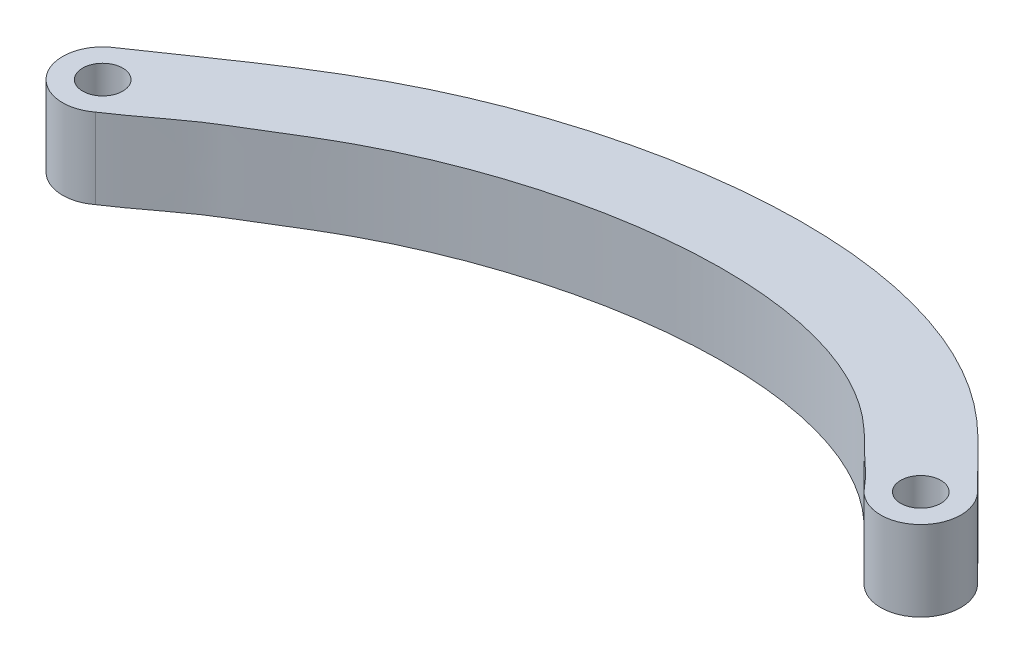
ISO-10303-21;
HEADER;
FILE_DESCRIPTION(('STEP AP214'),'2;1');
FILE_NAME('part.step','',(''),(''),'','','');
FILE_SCHEMA(('AUTOMOTIVE_DESIGN { 1 0 10303 214 1 1 1 1 }'));
ENDSEC;
DATA;
#1=APPLICATION_CONTEXT('core data for automotive mechanical design processes');
#2=APPLICATION_PROTOCOL_DEFINITION('international standard','automotive_design',2000,#1);
#3=PRODUCT_CONTEXT('',#1,'mechanical');
#4=PRODUCT('Part','Part','',(#3));
#5=PRODUCT_RELATED_PRODUCT_CATEGORY('part','',(#4));
#6=PRODUCT_DEFINITION_FORMATION('','',#4);
#7=PRODUCT_DEFINITION_CONTEXT('part definition',#1,'design');
#8=PRODUCT_DEFINITION('design','',#6,#7);
#9=PRODUCT_DEFINITION_SHAPE('','',#8);
#10=(LENGTH_UNIT() NAMED_UNIT(*) SI_UNIT(.MILLI.,.METRE.));
#11=(NAMED_UNIT(*) PLANE_ANGLE_UNIT() SI_UNIT($,.RADIAN.));
#12=(NAMED_UNIT(*) SI_UNIT($,.STERADIAN.) SOLID_ANGLE_UNIT());
#13=UNCERTAINTY_MEASURE_WITH_UNIT(LENGTH_MEASURE(1.E-05),#10,'distance_accuracy_value','');
#14=(GEOMETRIC_REPRESENTATION_CONTEXT(3) GLOBAL_UNCERTAINTY_ASSIGNED_CONTEXT((#13)) GLOBAL_UNIT_ASSIGNED_CONTEXT((#10,
#11,#12)) REPRESENTATION_CONTEXT('',''));
#15=CARTESIAN_POINT('',(0.,0.,0.));
#16=DIRECTION('',(0.,0.,1.));
#17=DIRECTION('',(1.,0.,0.));
#18=AXIS2_PLACEMENT_3D('',#15,#16,#17);
#19=CARTESIAN_POINT('',(-247.559802443743,5.,-7.30514918595101));
#20=DIRECTION('',(0.,-1.,0.));
#21=DIRECTION('',(0.,0.,-1.));
#22=AXIS2_PLACEMENT_3D('',#19,#20,#21);
#23=PLANE('',#22);
#24=CARTESIAN_POINT('',(-196.994213851386,5.,10.3512801003884));
#25=CARTESIAN_POINT('',(-199.941940379064,5.,7.45950954910146));
#26=CARTESIAN_POINT('',(-218.323545031006,5.,-13.6233138692077));
#27=CARTESIAN_POINT('',(-266.277956184964,5.,-8.03911435469407));
#28=CARTESIAN_POINT('',(-291.902418618622,5.,11.2395030229131));
#29=CARTESIAN_POINT('',(-299.304262271172,5.,16.2267211882028));
#30=B_SPLINE_CURVE_WITH_KNOTS('',3,(#24,#25,#26,#27,#28,#29),.UNSPECIFIED.,.F.,.F.,(4,1,1,4),
(0.847787985862279,13.2857809289112,83.7723300247783,110.926910792137),.UNSPECIFIED.);
#31=CARTESIAN_POINT('',(-196.994213851386,5.,10.3512801003883));
#32=VERTEX_POINT('',#31);
#33=CARTESIAN_POINT('',(-299.304262271172,5.,16.2267211882029));
#34=VERTEX_POINT('',#33);
#35=EDGE_CURVE('E90',#32,#34,#30,.T.);
#36=ORIENTED_EDGE('',*,*,#35,.T.);
#37=CARTESIAN_POINT('',(-296.247082258373,5.,20.1831906205809));
#38=DIRECTION('',(0.,1.,0.));
#39=DIRECTION('',(0.,0.,1.));
#40=AXIS2_PLACEMENT_3D('',#37,#38,#39);
#41=CIRCLE('',#40,5.00000000000012);
#42=CARTESIAN_POINT('',(-293.189902245573,5.,24.1396600529588));
#43=VERTEX_POINT('',#42);
#44=EDGE_CURVE('E85',#34,#43,#41,.T.);
#45=ORIENTED_EDGE('',*,*,#44,.T.);
#46=CARTESIAN_POINT('',(-293.189902245573,5.,24.1396600529586));
#47=CARTESIAN_POINT('',(-290.128839123827,5.,22.1527646537867));
#48=CARTESIAN_POINT('',(-286.786538548218,5.,19.3245691130097));
#49=CARTESIAN_POINT('',(-280.862415347682,5.,15.7721186848847));
#50=CARTESIAN_POINT('',(-277.679116823552,5.,13.7128335672985));
#51=CARTESIAN_POINT('',(-272.928108533201,5.,11.0950783828194));
#52=CARTESIAN_POINT('',(-271.48284950292,5.,10.3549770793911));
#53=CARTESIAN_POINT('',(-268.48487537178,5.,8.94352675828114));
#54=CARTESIAN_POINT('',(-266.938163872493,5.,8.27406812790166));
#55=CARTESIAN_POINT('',(-262.188625232405,5.,6.3930428973713));
#56=CARTESIAN_POINT('',(-258.876334976653,5.,5.30939919847095));
#57=CARTESIAN_POINT('',(-251.271297793378,5.,3.34081057085123));
#58=CARTESIAN_POINT('',(-246.94609164805,5.,2.58039893432338));
#59=CARTESIAN_POINT('',(-238.485670471804,5.,1.85277629984149));
#60=CARTESIAN_POINT('',(-234.351862704028,5.,1.8867328724077));
#61=CARTESIAN_POINT('',(-227.640002947983,5.,2.67914890433452));
#62=CARTESIAN_POINT('',(-224.938371934757,5.,3.245106431216));
#63=CARTESIAN_POINT('',(-219.946253899561,5.,4.82282769617703));
#64=CARTESIAN_POINT('',(-217.657198786714,5.,5.83239323328688));
#65=CARTESIAN_POINT('',(-214.770366393012,5.,7.54704740281298));
#66=CARTESIAN_POINT('',(-213.983977580702,5.,8.06935452395208));
#67=CARTESIAN_POINT('',(-212.538495104151,5.,9.14202518912854));
#68=CARTESIAN_POINT('',(-211.885373774132,5.,9.678435732968));
#69=CARTESIAN_POINT('',(-210.525303670813,5.,10.9028997435727));
#70=CARTESIAN_POINT('',(-209.829074094819,5.,11.5818432437418));
#71=CARTESIAN_POINT('',(-207.72908032503,5.,13.7519288887968));
#72=CARTESIAN_POINT('',(-205.990691885632,5.,15.1117708397097));
#73=CARTESIAN_POINT('',(-204.427137735067,5.,17.0409469485526));
#74=B_SPLINE_CURVE_WITH_KNOTS('',3,(#46,#47,#48,#49,#50,#51,#52,#53,#54,#55,#56,#57,#58,#59,#60,
#61,#62,#63,#64,#65,#66,#67,#68,#69,#70,#71,#72,#73),.UNSPECIFIED.,.F.,.F.,(4,2,2,2,2,2,2,2,2,2,
2,2,2,4),(0.921170625511825,12.4542405723983,24.9084811447966,30.2267904884506,35.5450998321046,
46.1817185194126,59.5646783706506,72.9476382218887,82.8385727611856,92.7295073004826,
96.6612238527306,100.281277533661,103.901331214592,110.926910792137),.UNSPECIFIED.);
#75=CARTESIAN_POINT('',(-204.427137735067,5.,17.0409469485526));
#76=VERTEX_POINT('',#75);
#77=EDGE_CURVE('E88',#43,#76,#74,.T.);
#78=ORIENTED_EDGE('',*,*,#77,.T.);
#79=CARTESIAN_POINT('',(-200.710675793227,5.,13.6961135244702));
#80=DIRECTION('',(0.,1.,0.));
#81=DIRECTION('',(0.,0.,1.));
#82=AXIS2_PLACEMENT_3D('',#79,#80,#81);
#83=CIRCLE('',#82,5.00000000000031);
#84=EDGE_CURVE('E55',#76,#32,#83,.T.);
#85=ORIENTED_EDGE('',*,*,#84,.T.);
#86=EDGE_LOOP('',(#36,#45,#78,#85));
#87=FACE_BOUND('',#86,.T.);
#88=CARTESIAN_POINT('',(-296.247082258373,5.,20.1831906205809));
#89=DIRECTION('',(0.,1.,0.));
#90=DIRECTION('',(0.,0.,1.));
#91=AXIS2_PLACEMENT_3D('',#88,#89,#90);
#92=CIRCLE('',#91,2.50000000000039);
#93=CARTESIAN_POINT('',(-296.247082258373,5.,22.6831906205813));
#94=VERTEX_POINT('',#93);
#95=EDGE_CURVE('E152',#94,#94,#92,.T.);
#96=ORIENTED_EDGE('',*,*,#95,.F.);
#97=EDGE_LOOP('',(#96));
#98=FACE_BOUND('',#97,.T.);
#99=CARTESIAN_POINT('',(-200.710675793227,5.,13.6961135244702));
#100=DIRECTION('',(0.,1.,0.));
#101=DIRECTION('',(0.,0.,1.));
#102=AXIS2_PLACEMENT_3D('',#99,#100,#101);
#103=CIRCLE('',#102,2.50000000000039);
#104=CARTESIAN_POINT('',(-200.710675793227,5.,16.1961135244706));
#105=VERTEX_POINT('',#104);
#106=EDGE_CURVE('E141',#105,#105,#103,.T.);
#107=ORIENTED_EDGE('',*,*,#106,.F.);
#108=EDGE_LOOP('',(#107));
#109=FACE_BOUND('',#108,.T.);
#110=ADVANCED_FACE('F36',(#87,#98,#109),#23,.F.);
#111=CARTESIAN_POINT('',(-247.559802443743,-5.,-7.30514918595101));
#112=DIRECTION('',(0.,-1.,0.));
#113=DIRECTION('',(0.,0.,-1.));
#114=AXIS2_PLACEMENT_3D('',#111,#112,#113);
#115=PLANE('',#114);
#116=CARTESIAN_POINT('',(-296.247082258373,-5.,20.1831906205809));
#117=DIRECTION('',(0.,1.,0.));
#118=DIRECTION('',(0.,0.,1.));
#119=AXIS2_PLACEMENT_3D('',#116,#117,#118);
#120=CIRCLE('',#119,2.50000000000039);
#121=CARTESIAN_POINT('',(-296.247082258373,-5.,22.6831906205813));
#122=VERTEX_POINT('',#121);
#123=EDGE_CURVE('E149',#122,#122,#120,.T.);
#124=ORIENTED_EDGE('',*,*,#123,.T.);
#125=EDGE_LOOP('',(#124));
#126=FACE_BOUND('',#125,.T.);
#127=CARTESIAN_POINT('',(-196.994213851386,-5.,10.3512801003884));
#128=CARTESIAN_POINT('',(-199.941940379064,-5.,7.45950954910146));
#129=CARTESIAN_POINT('',(-218.323545031006,-5.,-13.6233138692077));
#130=CARTESIAN_POINT('',(-266.277956184964,-5.,-8.03911435469407));
#131=CARTESIAN_POINT('',(-291.902418618622,-5.,11.2395030229131));
#132=CARTESIAN_POINT('',(-299.304262271172,-5.,16.2267211882028));
#133=B_SPLINE_CURVE_WITH_KNOTS('',3,(#127,#128,#129,#130,#131,#132),.UNSPECIFIED.,.F.,.F.,(4,1,
1,4),(0.847787985862279,13.2857809289112,83.7723300247783,110.926910792137),.UNSPECIFIED.);
#134=CARTESIAN_POINT('',(-196.994213851386,-5.,10.3512801003883));
#135=VERTEX_POINT('',#134);
#136=CARTESIAN_POINT('',(-299.304262271172,-5.,16.2267211882029));
#137=VERTEX_POINT('',#136);
#138=EDGE_CURVE('E156',#135,#137,#133,.T.);
#139=ORIENTED_EDGE('',*,*,#138,.F.);
#140=CARTESIAN_POINT('',(-200.710675793227,-5.,13.6961135244702));
#141=DIRECTION('',(0.,1.,0.));
#142=DIRECTION('',(0.,0.,1.));
#143=AXIS2_PLACEMENT_3D('',#140,#141,#142);
#144=CIRCLE('',#143,5.00000000000031);
#145=CARTESIAN_POINT('',(-204.427137735067,-5.,17.0409469485526));
#146=VERTEX_POINT('',#145);
#147=EDGE_CURVE('E78',#146,#135,#144,.T.);
#148=ORIENTED_EDGE('',*,*,#147,.F.);
#149=CARTESIAN_POINT('',(-293.189902245573,-5.,24.1396600529586));
#150=CARTESIAN_POINT('',(-290.128839123827,-5.,22.1527646537867));
#151=CARTESIAN_POINT('',(-286.786538548218,-5.,19.3245691130097));
#152=CARTESIAN_POINT('',(-280.862415347682,-5.,15.7721186848847));
#153=CARTESIAN_POINT('',(-277.679116823552,-5.,13.7128335672985));
#154=CARTESIAN_POINT('',(-272.928108533201,-5.,11.0950783828194));
#155=CARTESIAN_POINT('',(-271.48284950292,-5.,10.3549770793911));
#156=CARTESIAN_POINT('',(-268.48487537178,-5.,8.94352675828114));
#157=CARTESIAN_POINT('',(-266.938163872493,-5.,8.27406812790166));
#158=CARTESIAN_POINT('',(-262.188625232405,-5.,6.3930428973713));
#159=CARTESIAN_POINT('',(-258.876334976653,-5.,5.30939919847095));
#160=CARTESIAN_POINT('',(-251.271297793378,-5.,3.34081057085123));
#161=CARTESIAN_POINT('',(-246.94609164805,-5.,2.58039893432338));
#162=CARTESIAN_POINT('',(-238.485670471804,-5.,1.85277629984149));
#163=CARTESIAN_POINT('',(-234.351862704028,-5.,1.8867328724077));
#164=CARTESIAN_POINT('',(-227.640002947983,-5.,2.67914890433452));
#165=CARTESIAN_POINT('',(-224.938371934757,-5.,3.245106431216));
#166=CARTESIAN_POINT('',(-219.946253899561,-5.,4.82282769617703));
#167=CARTESIAN_POINT('',(-217.657198786714,-5.,5.83239323328688));
#168=CARTESIAN_POINT('',(-214.770366393012,-5.,7.54704740281298));
#169=CARTESIAN_POINT('',(-213.983977580702,-5.,8.06935452395208));
#170=CARTESIAN_POINT('',(-212.538495104151,-5.,9.14202518912854));
#171=CARTESIAN_POINT('',(-211.885373774132,-5.,9.678435732968));
#172=CARTESIAN_POINT('',(-210.525303670813,-5.,10.9028997435727));
#173=CARTESIAN_POINT('',(-209.829074094819,-5.,11.5818432437418));
#174=CARTESIAN_POINT('',(-207.72908032503,-5.,13.7519288887968));
#175=CARTESIAN_POINT('',(-205.990691885632,-5.,15.1117708397097));
#176=CARTESIAN_POINT('',(-204.427137735067,-5.,17.0409469485526));
#177=B_SPLINE_CURVE_WITH_KNOTS('',3,(#149,#150,#151,#152,#153,#154,#155,#156,#157,#158,#159,
#160,#161,#162,#163,#164,#165,#166,#167,#168,#169,#170,#171,#172,#173,#174,#175,#176),
.UNSPECIFIED.,.F.,.F.,(4,2,2,2,2,2,2,2,2,2,2,2,2,4),(0.921170625511825,12.4542405723983,
24.9084811447966,30.2267904884506,35.5450998321046,46.1817185194126,59.5646783706506,
72.9476382218887,82.8385727611856,92.7295073004826,96.6612238527306,100.281277533661,
103.901331214592,110.926910792137),.UNSPECIFIED.);
#178=CARTESIAN_POINT('',(-293.189902245573,-5.,24.1396600529588));
#179=VERTEX_POINT('',#178);
#180=EDGE_CURVE('E72',#179,#146,#177,.T.);
#181=ORIENTED_EDGE('',*,*,#180,.F.);
#182=CARTESIAN_POINT('',(-296.247082258373,-5.,20.1831906205809));
#183=DIRECTION('',(0.,1.,0.));
#184=DIRECTION('',(0.,0.,1.));
#185=AXIS2_PLACEMENT_3D('',#182,#183,#184);
#186=CIRCLE('',#185,5.00000000000012);
#187=EDGE_CURVE('E95',#137,#179,#186,.T.);
#188=ORIENTED_EDGE('',*,*,#187,.F.);
#189=EDGE_LOOP('',(#139,#148,#181,#188));
#190=FACE_BOUND('',#189,.T.);
#191=CARTESIAN_POINT('',(-200.710675793227,-5.,13.6961135244702));
#192=DIRECTION('',(0.,1.,0.));
#193=DIRECTION('',(0.,0.,1.));
#194=AXIS2_PLACEMENT_3D('',#191,#192,#193);
#195=CIRCLE('',#194,2.50000000000039);
#196=CARTESIAN_POINT('',(-200.710675793227,-5.,16.1961135244706));
#197=VERTEX_POINT('',#196);
#198=EDGE_CURVE('E144',#197,#197,#195,.T.);
#199=ORIENTED_EDGE('',*,*,#198,.T.);
#200=EDGE_LOOP('',(#199));
#201=FACE_BOUND('',#200,.T.);
#202=ADVANCED_FACE('F120',(#126,#190,#201),#115,.T.);
#203=DIRECTION('',(0.,-1.,0.));
#204=VECTOR('',#203,1.);
#205=SURFACE_OF_LINEAR_EXTRUSION('',#30,#204);
#206=ORIENTED_EDGE('',*,*,#138,.T.);
#207=DIRECTION('',(0.,-1.,0.));
#208=VECTOR('',#207,1.);
#209=CARTESIAN_POINT('',(-299.304262271172,5.,16.2267211882029));
#210=LINE('',#209,#208);
#211=EDGE_CURVE('E11',#34,#137,#210,.T.);
#212=ORIENTED_EDGE('',*,*,#211,.F.);
#213=ORIENTED_EDGE('',*,*,#35,.F.);
#214=DIRECTION('',(0.,-1.,0.));
#215=VECTOR('',#214,1.);
#216=CARTESIAN_POINT('',(-196.994213851386,5.,10.3512801003883));
#217=LINE('',#216,#215);
#218=EDGE_CURVE('E102',#32,#135,#217,.T.);
#219=ORIENTED_EDGE('',*,*,#218,.T.);
#220=EDGE_LOOP('',(#206,#212,#213,#219));
#221=FACE_BOUND('',#220,.T.);
#222=ADVANCED_FACE('F38',(#221),#205,.F.);
#223=CARTESIAN_POINT('',(-296.247082258373,5.,20.1831906205809));
#224=DIRECTION('',(0.,-1.,0.));
#225=DIRECTION('',(0.,0.,-1.));
#226=AXIS2_PLACEMENT_3D('',#223,#224,#225);
#227=CYLINDRICAL_SURFACE('',#226,5.00000000000012);
#228=ORIENTED_EDGE('',*,*,#187,.T.);
#229=DIRECTION('',(0.,-1.,0.));
#230=VECTOR('',#229,1.);
#231=CARTESIAN_POINT('',(-293.189902245573,5.,24.1396600529588));
#232=LINE('',#231,#230);
#233=EDGE_CURVE('E47',#43,#179,#232,.T.);
#234=ORIENTED_EDGE('',*,*,#233,.F.);
#235=ORIENTED_EDGE('',*,*,#44,.F.);
#236=ORIENTED_EDGE('',*,*,#211,.T.);
#237=EDGE_LOOP('',(#228,#234,#235,#236));
#238=FACE_BOUND('',#237,.T.);
#239=ADVANCED_FACE('F94',(#238),#227,.T.);
#240=DIRECTION('',(0.,-1.,0.));
#241=VECTOR('',#240,1.);
#242=SURFACE_OF_LINEAR_EXTRUSION('',#74,#241);
#243=ORIENTED_EDGE('',*,*,#180,.T.);
#244=DIRECTION('',(0.,-1.,0.));
#245=VECTOR('',#244,1.);
#246=CARTESIAN_POINT('',(-204.427137735067,5.,17.0409469485526));
#247=LINE('',#246,#245);
#248=EDGE_CURVE('E97',#76,#146,#247,.T.);
#249=ORIENTED_EDGE('',*,*,#248,.F.);
#250=ORIENTED_EDGE('',*,*,#77,.F.);
#251=ORIENTED_EDGE('',*,*,#233,.T.);
#252=EDGE_LOOP('',(#243,#249,#250,#251));
#253=FACE_BOUND('',#252,.T.);
#254=ADVANCED_FACE('F98',(#253),#242,.F.);
#255=CARTESIAN_POINT('',(-200.710675793227,5.,13.6961135244702));
#256=DIRECTION('',(0.,-1.,0.));
#257=DIRECTION('',(0.,0.,-1.));
#258=AXIS2_PLACEMENT_3D('',#255,#256,#257);
#259=CYLINDRICAL_SURFACE('',#258,5.00000000000031);
#260=ORIENTED_EDGE('',*,*,#147,.T.);
#261=ORIENTED_EDGE('',*,*,#218,.F.);
#262=ORIENTED_EDGE('',*,*,#84,.F.);
#263=ORIENTED_EDGE('',*,*,#248,.T.);
#264=EDGE_LOOP('',(#260,#261,#262,#263));
#265=FACE_BOUND('',#264,.T.);
#266=ADVANCED_FACE('F114',(#265),#259,.T.);
#267=CARTESIAN_POINT('',(-296.247082258373,5.,20.1831906205809));
#268=DIRECTION('',(0.,-1.,0.));
#269=DIRECTION('',(0.,0.,-1.));
#270=AXIS2_PLACEMENT_3D('',#267,#268,#269);
#271=CYLINDRICAL_SURFACE('',#270,2.50000000000039);
#272=ORIENTED_EDGE('',*,*,#95,.T.);
#273=EDGE_LOOP('',(#272));
#274=FACE_BOUND('',#273,.T.);
#275=ORIENTED_EDGE('',*,*,#123,.F.);
#276=EDGE_LOOP('',(#275));
#277=FACE_BOUND('',#276,.T.);
#278=ADVANCED_FACE('F129',(#274,#277),#271,.F.);
#279=CARTESIAN_POINT('',(-200.710675793227,5.,13.6961135244702));
#280=DIRECTION('',(0.,-1.,0.));
#281=DIRECTION('',(0.,0.,-1.));
#282=AXIS2_PLACEMENT_3D('',#279,#280,#281);
#283=CYLINDRICAL_SURFACE('',#282,2.50000000000039);
#284=ORIENTED_EDGE('',*,*,#106,.T.);
#285=EDGE_LOOP('',(#284));
#286=FACE_BOUND('',#285,.T.);
#287=ORIENTED_EDGE('',*,*,#198,.F.);
#288=EDGE_LOOP('',(#287));
#289=FACE_BOUND('',#288,.T.);
#290=ADVANCED_FACE('F132',(#286,#289),#283,.F.);
#291=CLOSED_SHELL('',(#110,#202,#222,#239,#254,#266,#278,#290));
#292=MANIFOLD_SOLID_BREP('B2',#291);
#293=ADVANCED_BREP_SHAPE_REPRESENTATION('',(#18,#292),#14);
#294=SHAPE_DEFINITION_REPRESENTATION(#9,#293);
ENDSEC;
END-ISO-10303-21;
